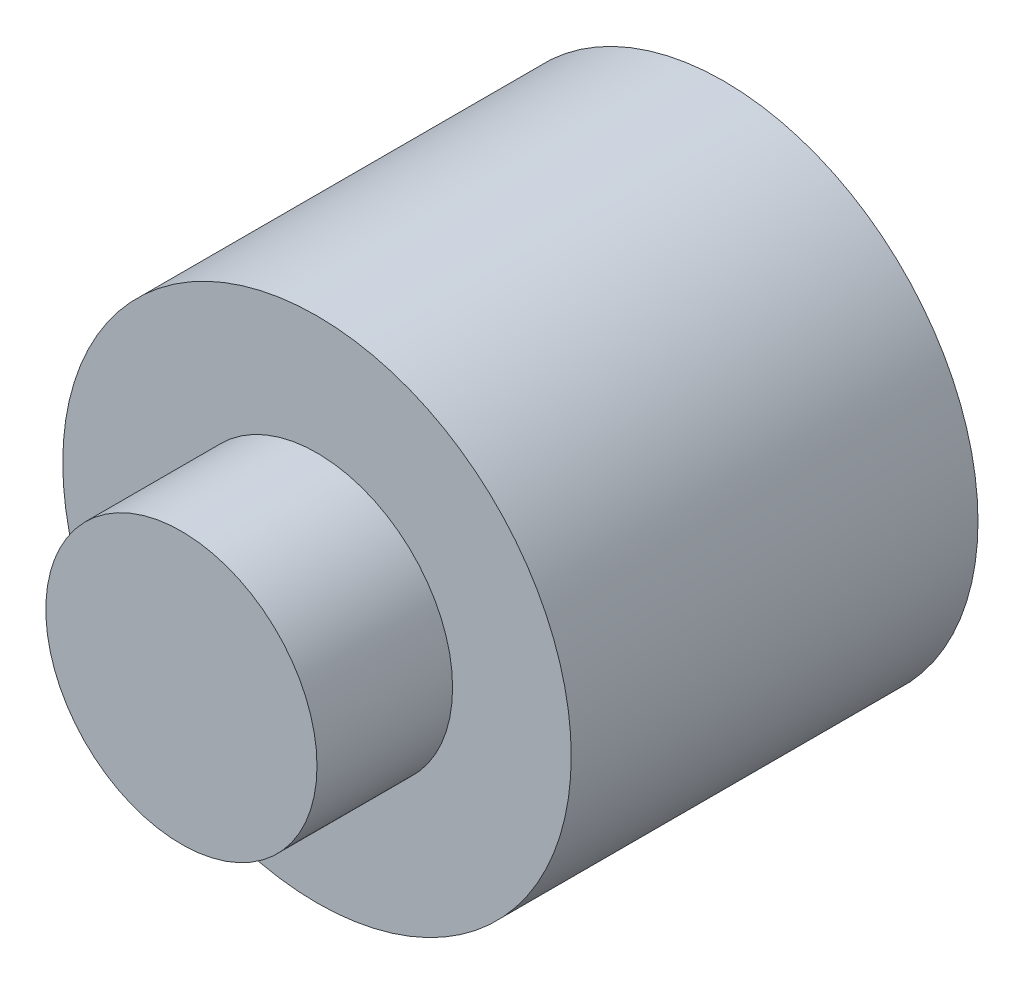
ISO-10303-21;
HEADER;
FILE_DESCRIPTION(('STEP AP214'),'2;1');
FILE_NAME('part.step','',(''),(''),'','','');
FILE_SCHEMA(('AUTOMOTIVE_DESIGN { 1 0 10303 214 1 1 1 1 }'));
ENDSEC;
DATA;
#1=APPLICATION_CONTEXT('core data for automotive mechanical design processes');
#2=APPLICATION_PROTOCOL_DEFINITION('international standard','automotive_design',2000,#1);
#3=PRODUCT_CONTEXT('',#1,'mechanical');
#4=PRODUCT('Part','Part','',(#3));
#5=PRODUCT_RELATED_PRODUCT_CATEGORY('part','',(#4));
#6=PRODUCT_DEFINITION_FORMATION('','',#4);
#7=PRODUCT_DEFINITION_CONTEXT('part definition',#1,'design');
#8=PRODUCT_DEFINITION('design','',#6,#7);
#9=PRODUCT_DEFINITION_SHAPE('','',#8);
#10=(LENGTH_UNIT() NAMED_UNIT(*) SI_UNIT(.MILLI.,.METRE.));
#11=(NAMED_UNIT(*) PLANE_ANGLE_UNIT() SI_UNIT($,.RADIAN.));
#12=(NAMED_UNIT(*) SI_UNIT($,.STERADIAN.) SOLID_ANGLE_UNIT());
#13=UNCERTAINTY_MEASURE_WITH_UNIT(LENGTH_MEASURE(1.E-05),#10,'distance_accuracy_value','');
#14=(GEOMETRIC_REPRESENTATION_CONTEXT(3) GLOBAL_UNCERTAINTY_ASSIGNED_CONTEXT((#13)) GLOBAL_UNIT_ASSIGNED_CONTEXT((#10,
#11,#12)) REPRESENTATION_CONTEXT('',''));
#15=CARTESIAN_POINT('',(0.,0.,0.));
#16=DIRECTION('',(0.,0.,1.));
#17=DIRECTION('',(1.,0.,0.));
#18=AXIS2_PLACEMENT_3D('',#15,#16,#17);
#19=CARTESIAN_POINT('',(0.,0.,12.7));
#20=DIRECTION('',(0.,0.,-1.));
#21=DIRECTION('',(-1.,0.,0.));
#22=AXIS2_PLACEMENT_3D('',#19,#20,#21);
#23=CYLINDRICAL_SURFACE('',#22,12.7);
#24=CARTESIAN_POINT('',(0.,0.,12.7));
#25=DIRECTION('',(0.,0.,1.));
#26=DIRECTION('',(1.,0.,0.));
#27=AXIS2_PLACEMENT_3D('',#24,#25,#26);
#28=CIRCLE('',#27,12.7);
#29=CARTESIAN_POINT('',(12.7,0.,12.7));
#30=VERTEX_POINT('',#29);
#31=EDGE_CURVE('E10',#30,#30,#28,.T.);
#32=ORIENTED_EDGE('',*,*,#31,.F.);
#33=EDGE_LOOP('',(#32));
#34=FACE_BOUND('',#33,.T.);
#35=CARTESIAN_POINT('',(0.,0.,0.));
#36=DIRECTION('',(0.,0.,1.));
#37=DIRECTION('',(1.,0.,0.));
#38=AXIS2_PLACEMENT_3D('',#35,#36,#37);
#39=CIRCLE('',#38,12.7);
#40=CARTESIAN_POINT('',(12.7,0.,0.));
#41=VERTEX_POINT('',#40);
#42=EDGE_CURVE('E18',#41,#41,#39,.T.);
#43=ORIENTED_EDGE('',*,*,#42,.T.);
#44=EDGE_LOOP('',(#43));
#45=FACE_BOUND('',#44,.T.);
#46=ADVANCED_FACE('F15',(#34,#45),#23,.T.);
#47=CARTESIAN_POINT('',(0.,0.,12.7));
#48=DIRECTION('',(0.,0.,1.));
#49=DIRECTION('',(1.,0.,0.));
#50=AXIS2_PLACEMENT_3D('',#47,#48,#49);
#51=PLANE('',#50);
#52=ORIENTED_EDGE('',*,*,#31,.T.);
#53=EDGE_LOOP('',(#52));
#54=FACE_BOUND('',#53,.T.);
#55=ADVANCED_FACE('F38',(#54),#51,.T.);
#56=CARTESIAN_POINT('',(0.,0.,-38.1));
#57=DIRECTION('',(0.,0.,1.));
#58=DIRECTION('',(1.,0.,0.));
#59=AXIS2_PLACEMENT_3D('',#56,#57,#58);
#60=CYLINDRICAL_SURFACE('',#59,23.8125);
#61=CARTESIAN_POINT('',(0.,0.,-38.1));
#62=DIRECTION('',(0.,0.,-1.));
#63=DIRECTION('',(-1.,0.,0.));
#64=AXIS2_PLACEMENT_3D('',#61,#62,#63);
#65=CIRCLE('',#64,23.8125);
#66=CARTESIAN_POINT('',(-23.8125,0.,-38.1));
#67=VERTEX_POINT('',#66);
#68=EDGE_CURVE('E25',#67,#67,#65,.T.);
#69=ORIENTED_EDGE('',*,*,#68,.F.);
#70=EDGE_LOOP('',(#69));
#71=FACE_BOUND('',#70,.T.);
#72=CARTESIAN_POINT('',(0.,0.,0.));
#73=DIRECTION('',(0.,0.,-1.));
#74=DIRECTION('',(-1.,0.,0.));
#75=AXIS2_PLACEMENT_3D('',#72,#73,#74);
#76=CIRCLE('',#75,23.8125);
#77=CARTESIAN_POINT('',(-23.8125,0.,0.));
#78=VERTEX_POINT('',#77);
#79=EDGE_CURVE('E27',#78,#78,#76,.T.);
#80=ORIENTED_EDGE('',*,*,#79,.T.);
#81=EDGE_LOOP('',(#80));
#82=FACE_BOUND('',#81,.T.);
#83=ADVANCED_FACE('F35',(#71,#82),#60,.T.);
#84=CARTESIAN_POINT('',(0.,0.,-38.1));
#85=DIRECTION('',(0.,0.,-1.));
#86=DIRECTION('',(1.,0.,0.));
#87=AXIS2_PLACEMENT_3D('',#84,#85,#86);
#88=PLANE('',#87);
#89=ORIENTED_EDGE('',*,*,#68,.T.);
#90=EDGE_LOOP('',(#89));
#91=FACE_BOUND('',#90,.T.);
#92=ADVANCED_FACE('F33',(#91),#88,.T.);
#93=CARTESIAN_POINT('',(0.,0.,0.));
#94=DIRECTION('',(0.,0.,-1.));
#95=DIRECTION('',(1.,0.,0.));
#96=AXIS2_PLACEMENT_3D('',#93,#94,#95);
#97=PLANE('',#96);
#98=ORIENTED_EDGE('',*,*,#42,.F.);
#99=EDGE_LOOP('',(#98));
#100=FACE_BOUND('',#99,.T.);
#101=ORIENTED_EDGE('',*,*,#79,.F.);
#102=EDGE_LOOP('',(#101));
#103=FACE_BOUND('',#102,.T.);
#104=ADVANCED_FACE('F42',(#100,#103),#97,.F.);
#105=CLOSED_SHELL('',(#46,#55,#83,#92,#104));
#106=MANIFOLD_SOLID_BREP('B1',#105);
#107=ADVANCED_BREP_SHAPE_REPRESENTATION('',(#18,#106),#14);
#108=SHAPE_DEFINITION_REPRESENTATION(#9,#107);
ENDSEC;
END-ISO-10303-21;
